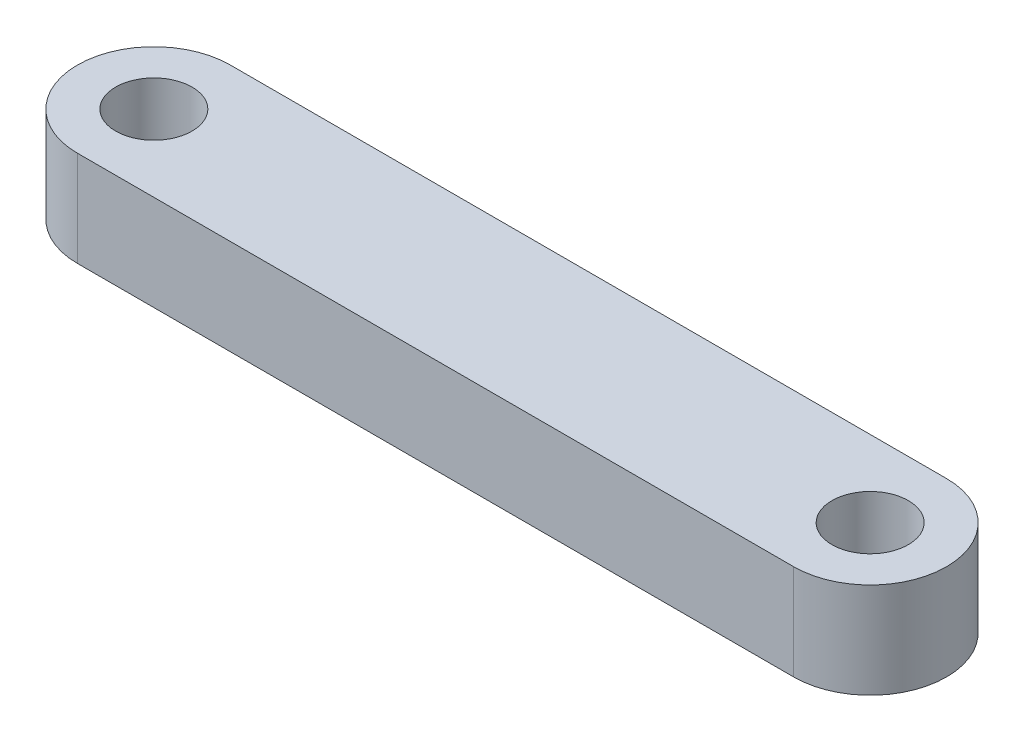
ISO-10303-21;
HEADER;
FILE_DESCRIPTION(('STEP AP214'),'2;1');
FILE_NAME('part.step','',(''),(''),'','','');
FILE_SCHEMA(('AUTOMOTIVE_DESIGN { 1 0 10303 214 1 1 1 1 }'));
ENDSEC;
DATA;
#1=APPLICATION_CONTEXT('core data for automotive mechanical design processes');
#2=APPLICATION_PROTOCOL_DEFINITION('international standard','automotive_design',2000,#1);
#3=PRODUCT_CONTEXT('',#1,'mechanical');
#4=PRODUCT('Part','Part','',(#3));
#5=PRODUCT_RELATED_PRODUCT_CATEGORY('part','',(#4));
#6=PRODUCT_DEFINITION_FORMATION('','',#4);
#7=PRODUCT_DEFINITION_CONTEXT('part definition',#1,'design');
#8=PRODUCT_DEFINITION('design','',#6,#7);
#9=PRODUCT_DEFINITION_SHAPE('','',#8);
#10=(LENGTH_UNIT() NAMED_UNIT(*) SI_UNIT(.MILLI.,.METRE.));
#11=(NAMED_UNIT(*) PLANE_ANGLE_UNIT() SI_UNIT($,.RADIAN.));
#12=(NAMED_UNIT(*) SI_UNIT($,.STERADIAN.) SOLID_ANGLE_UNIT());
#13=UNCERTAINTY_MEASURE_WITH_UNIT(LENGTH_MEASURE(1.E-05),#10,'distance_accuracy_value','');
#14=(GEOMETRIC_REPRESENTATION_CONTEXT(3) GLOBAL_UNCERTAINTY_ASSIGNED_CONTEXT((#13)) GLOBAL_UNIT_ASSIGNED_CONTEXT((#10,
#11,#12)) REPRESENTATION_CONTEXT('',''));
#15=CARTESIAN_POINT('',(0.,0.,0.));
#16=DIRECTION('',(0.,0.,1.));
#17=DIRECTION('',(1.,0.,0.));
#18=AXIS2_PLACEMENT_3D('',#15,#16,#17);
#19=CARTESIAN_POINT('',(-130.,10.,8.));
#20=DIRECTION('',(0.,1.,0.));
#21=DIRECTION('',(0.,0.,1.));
#22=AXIS2_PLACEMENT_3D('',#19,#20,#21);
#23=PLANE('',#22);
#24=CARTESIAN_POINT('',(-130.,10.,8.));
#25=DIRECTION('',(0.,1.,0.));
#26=DIRECTION('',(0.,0.,1.));
#27=AXIS2_PLACEMENT_3D('',#24,#25,#26);
#28=CIRCLE('',#27,3.99999999999999);
#29=CARTESIAN_POINT('',(-130.,10.,12.));
#30=VERTEX_POINT('',#29);
#31=EDGE_CURVE('E100',#30,#30,#28,.T.);
#32=ORIENTED_EDGE('',*,*,#31,.F.);
#33=EDGE_LOOP('',(#32));
#34=FACE_BOUND('',#33,.T.);
#35=CARTESIAN_POINT('',(-130.,10.,8.));
#36=DIRECTION('',(0.,1.,0.));
#37=DIRECTION('',(0.,0.,1.));
#38=AXIS2_PLACEMENT_3D('',#35,#36,#37);
#39=CIRCLE('',#38,8.);
#40=CARTESIAN_POINT('',(-130.,10.,0.));
#41=VERTEX_POINT('',#40);
#42=CARTESIAN_POINT('',(-130.,10.,16.));
#43=VERTEX_POINT('',#42);
#44=EDGE_CURVE('E85',#41,#43,#39,.T.);
#45=ORIENTED_EDGE('',*,*,#44,.T.);
#46=DIRECTION('',(1.,0.,0.));
#47=VECTOR('',#46,1.);
#48=CARTESIAN_POINT('',(-130.,10.,16.));
#49=LINE('',#48,#47);
#50=CARTESIAN_POINT('',(-55.,10.,16.));
#51=VERTEX_POINT('',#50);
#52=EDGE_CURVE('E80',#43,#51,#49,.T.);
#53=ORIENTED_EDGE('',*,*,#52,.T.);
#54=CARTESIAN_POINT('',(-55.,10.,8.));
#55=DIRECTION('',(0.,1.,0.));
#56=DIRECTION('',(0.,0.,-1.));
#57=AXIS2_PLACEMENT_3D('',#54,#55,#56);
#58=CIRCLE('',#57,8.);
#59=CARTESIAN_POINT('',(-55.,10.,0.));
#60=VERTEX_POINT('',#59);
#61=EDGE_CURVE('E83',#51,#60,#58,.T.);
#62=ORIENTED_EDGE('',*,*,#61,.T.);
#63=DIRECTION('',(-1.,0.,0.));
#64=VECTOR('',#63,1.);
#65=CARTESIAN_POINT('',(-130.,10.,0.));
#66=LINE('',#65,#64);
#67=EDGE_CURVE('E50',#60,#41,#66,.T.);
#68=ORIENTED_EDGE('',*,*,#67,.T.);
#69=EDGE_LOOP('',(#45,#53,#62,#68));
#70=FACE_BOUND('',#69,.T.);
#71=CARTESIAN_POINT('',(-55.,10.,8.));
#72=DIRECTION('',(0.,1.,0.));
#73=DIRECTION('',(0.,0.,1.));
#74=AXIS2_PLACEMENT_3D('',#71,#72,#73);
#75=CIRCLE('',#74,3.99999999999999);
#76=CARTESIAN_POINT('',(-55.,10.,12.));
#77=VERTEX_POINT('',#76);
#78=EDGE_CURVE('E115',#77,#77,#75,.T.);
#79=ORIENTED_EDGE('',*,*,#78,.F.);
#80=EDGE_LOOP('',(#79));
#81=FACE_BOUND('',#80,.T.);
#82=ADVANCED_FACE('F33',(#34,#70,#81),#23,.T.);
#83=CARTESIAN_POINT('',(-130.,0.,8.));
#84=DIRECTION('',(0.,1.,0.));
#85=DIRECTION('',(0.,0.,1.));
#86=AXIS2_PLACEMENT_3D('',#83,#84,#85);
#87=PLANE('',#86);
#88=CARTESIAN_POINT('',(-130.,0.,8.));
#89=DIRECTION('',(0.,1.,0.));
#90=DIRECTION('',(0.,0.,1.));
#91=AXIS2_PLACEMENT_3D('',#88,#89,#90);
#92=CIRCLE('',#91,8.);
#93=CARTESIAN_POINT('',(-130.,0.,0.));
#94=VERTEX_POINT('',#93);
#95=CARTESIAN_POINT('',(-130.,0.,16.));
#96=VERTEX_POINT('',#95);
#97=EDGE_CURVE('E97',#94,#96,#92,.T.);
#98=ORIENTED_EDGE('',*,*,#97,.F.);
#99=DIRECTION('',(-1.,0.,0.));
#100=VECTOR('',#99,1.);
#101=CARTESIAN_POINT('',(-130.,0.,0.));
#102=LINE('',#101,#100);
#103=CARTESIAN_POINT('',(-55.,0.,0.));
#104=VERTEX_POINT('',#103);
#105=EDGE_CURVE('E73',#104,#94,#102,.T.);
#106=ORIENTED_EDGE('',*,*,#105,.F.);
#107=CARTESIAN_POINT('',(-55.,0.,8.));
#108=DIRECTION('',(0.,1.,0.));
#109=DIRECTION('',(0.,0.,-1.));
#110=AXIS2_PLACEMENT_3D('',#107,#108,#109);
#111=CIRCLE('',#110,8.);
#112=CARTESIAN_POINT('',(-55.,0.,16.));
#113=VERTEX_POINT('',#112);
#114=EDGE_CURVE('E67',#113,#104,#111,.T.);
#115=ORIENTED_EDGE('',*,*,#114,.F.);
#116=DIRECTION('',(1.,0.,0.));
#117=VECTOR('',#116,1.);
#118=CARTESIAN_POINT('',(-130.,0.,16.));
#119=LINE('',#118,#117);
#120=EDGE_CURVE('E89',#96,#113,#119,.T.);
#121=ORIENTED_EDGE('',*,*,#120,.F.);
#122=EDGE_LOOP('',(#98,#106,#115,#121));
#123=FACE_BOUND('',#122,.T.);
#124=CARTESIAN_POINT('',(-130.,0.,8.));
#125=DIRECTION('',(0.,1.,0.));
#126=DIRECTION('',(0.,0.,1.));
#127=AXIS2_PLACEMENT_3D('',#124,#125,#126);
#128=CIRCLE('',#127,3.99999999999999);
#129=CARTESIAN_POINT('',(-130.,0.,12.));
#130=VERTEX_POINT('',#129);
#131=EDGE_CURVE('E112',#130,#130,#128,.T.);
#132=ORIENTED_EDGE('',*,*,#131,.T.);
#133=EDGE_LOOP('',(#132));
#134=FACE_BOUND('',#133,.T.);
#135=CARTESIAN_POINT('',(-55.,0.,8.));
#136=DIRECTION('',(0.,1.,0.));
#137=DIRECTION('',(0.,0.,1.));
#138=AXIS2_PLACEMENT_3D('',#135,#136,#137);
#139=CIRCLE('',#138,3.99999999999999);
#140=CARTESIAN_POINT('',(-55.,0.,12.));
#141=VERTEX_POINT('',#140);
#142=EDGE_CURVE('E118',#141,#141,#139,.T.);
#143=ORIENTED_EDGE('',*,*,#142,.T.);
#144=EDGE_LOOP('',(#143));
#145=FACE_BOUND('',#144,.T.);
#146=ADVANCED_FACE('F108',(#123,#134,#145),#87,.F.);
#147=CARTESIAN_POINT('',(-130.,10.,8.));
#148=DIRECTION('',(0.,-1.,0.));
#149=DIRECTION('',(0.,0.,-1.));
#150=AXIS2_PLACEMENT_3D('',#147,#148,#149);
#151=CYLINDRICAL_SURFACE('',#150,8.);
#152=ORIENTED_EDGE('',*,*,#97,.T.);
#153=DIRECTION('',(0.,-1.,0.));
#154=VECTOR('',#153,1.);
#155=CARTESIAN_POINT('',(-130.,10.,16.));
#156=LINE('',#155,#154);
#157=EDGE_CURVE('E11',#43,#96,#156,.T.);
#158=ORIENTED_EDGE('',*,*,#157,.F.);
#159=ORIENTED_EDGE('',*,*,#44,.F.);
#160=DIRECTION('',(0.,-1.,0.));
#161=VECTOR('',#160,1.);
#162=CARTESIAN_POINT('',(-130.,10.,0.));
#163=LINE('',#162,#161);
#164=EDGE_CURVE('E93',#41,#94,#163,.T.);
#165=ORIENTED_EDGE('',*,*,#164,.T.);
#166=EDGE_LOOP('',(#152,#158,#159,#165));
#167=FACE_BOUND('',#166,.T.);
#168=ADVANCED_FACE('F35',(#167),#151,.T.);
#169=CARTESIAN_POINT('',(-130.,10.,16.));
#170=DIRECTION('',(0.,0.,-1.));
#171=DIRECTION('',(-1.,0.,0.));
#172=AXIS2_PLACEMENT_3D('',#169,#170,#171);
#173=PLANE('',#172);
#174=ORIENTED_EDGE('',*,*,#120,.T.);
#175=DIRECTION('',(0.,-1.,0.));
#176=VECTOR('',#175,1.);
#177=CARTESIAN_POINT('',(-55.,10.,16.));
#178=LINE('',#177,#176);
#179=EDGE_CURVE('E42',#51,#113,#178,.T.);
#180=ORIENTED_EDGE('',*,*,#179,.F.);
#181=ORIENTED_EDGE('',*,*,#52,.F.);
#182=ORIENTED_EDGE('',*,*,#157,.T.);
#183=EDGE_LOOP('',(#174,#180,#181,#182));
#184=FACE_BOUND('',#183,.T.);
#185=ADVANCED_FACE('F88',(#184),#173,.F.);
#186=CARTESIAN_POINT('',(-55.,10.,8.));
#187=DIRECTION('',(0.,-1.,0.));
#188=DIRECTION('',(0.,0.,-1.));
#189=AXIS2_PLACEMENT_3D('',#186,#187,#188);
#190=CYLINDRICAL_SURFACE('',#189,8.);
#191=ORIENTED_EDGE('',*,*,#114,.T.);
#192=DIRECTION('',(0.,-1.,0.));
#193=VECTOR('',#192,1.);
#194=CARTESIAN_POINT('',(-55.,10.,0.));
#195=LINE('',#194,#193);
#196=EDGE_CURVE('E90',#60,#104,#195,.T.);
#197=ORIENTED_EDGE('',*,*,#196,.F.);
#198=ORIENTED_EDGE('',*,*,#61,.F.);
#199=ORIENTED_EDGE('',*,*,#179,.T.);
#200=EDGE_LOOP('',(#191,#197,#198,#199));
#201=FACE_BOUND('',#200,.T.);
#202=ADVANCED_FACE('F91',(#201),#190,.T.);
#203=CARTESIAN_POINT('',(-130.,10.,0.));
#204=DIRECTION('',(0.,0.,1.));
#205=DIRECTION('',(1.,0.,0.));
#206=AXIS2_PLACEMENT_3D('',#203,#204,#205);
#207=PLANE('',#206);
#208=ORIENTED_EDGE('',*,*,#105,.T.);
#209=ORIENTED_EDGE('',*,*,#164,.F.);
#210=ORIENTED_EDGE('',*,*,#67,.F.);
#211=ORIENTED_EDGE('',*,*,#196,.T.);
#212=EDGE_LOOP('',(#208,#209,#210,#211));
#213=FACE_BOUND('',#212,.T.);
#214=ADVANCED_FACE('F105',(#213),#207,.F.);
#215=CARTESIAN_POINT('',(-130.,10.,8.));
#216=DIRECTION('',(0.,-1.,0.));
#217=DIRECTION('',(0.,0.,-1.));
#218=AXIS2_PLACEMENT_3D('',#215,#216,#217);
#219=CYLINDRICAL_SURFACE('',#218,3.99999999999999);
#220=ORIENTED_EDGE('',*,*,#31,.T.);
#221=EDGE_LOOP('',(#220));
#222=FACE_BOUND('',#221,.T.);
#223=ORIENTED_EDGE('',*,*,#131,.F.);
#224=EDGE_LOOP('',(#223));
#225=FACE_BOUND('',#224,.T.);
#226=ADVANCED_FACE('F135',(#222,#225),#219,.F.);
#227=CARTESIAN_POINT('',(-55.,10.,8.));
#228=DIRECTION('',(0.,-1.,0.));
#229=DIRECTION('',(0.,0.,-1.));
#230=AXIS2_PLACEMENT_3D('',#227,#228,#229);
#231=CYLINDRICAL_SURFACE('',#230,3.99999999999999);
#232=ORIENTED_EDGE('',*,*,#78,.T.);
#233=EDGE_LOOP('',(#232));
#234=FACE_BOUND('',#233,.T.);
#235=ORIENTED_EDGE('',*,*,#142,.F.);
#236=EDGE_LOOP('',(#235));
#237=FACE_BOUND('',#236,.T.);
#238=ADVANCED_FACE('F124',(#234,#237),#231,.F.);
#239=CLOSED_SHELL('',(#82,#146,#168,#185,#202,#214,#226,#238));
#240=MANIFOLD_SOLID_BREP('B2',#239);
#241=ADVANCED_BREP_SHAPE_REPRESENTATION('',(#18,#240),#14);
#242=SHAPE_DEFINITION_REPRESENTATION(#9,#241);
ENDSEC;
END-ISO-10303-21;
